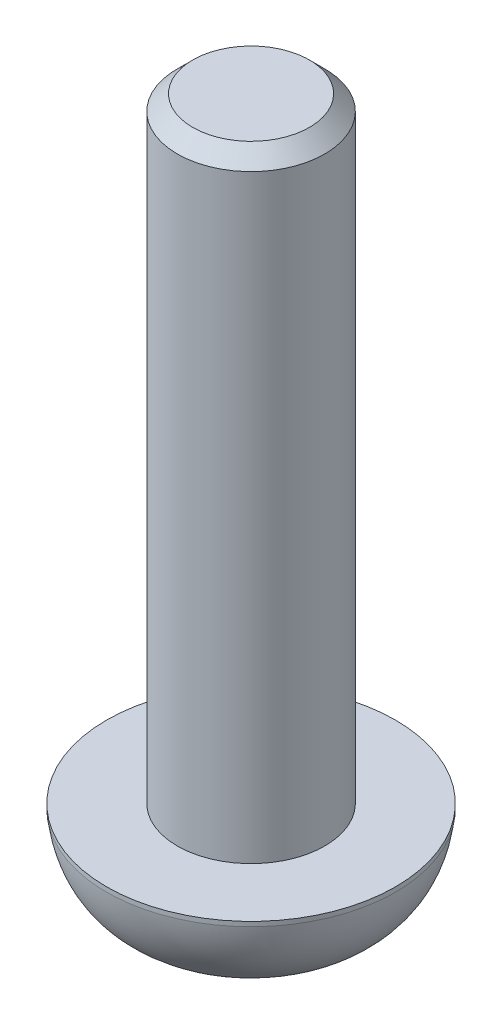
ISO-10303-21;
HEADER;
FILE_DESCRIPTION(('STEP AP214'),'2;1');
FILE_NAME('part.step','',(''),(''),'','','');
FILE_SCHEMA(('AUTOMOTIVE_DESIGN { 1 0 10303 214 1 1 1 1 }'));
ENDSEC;
DATA;
#1=APPLICATION_CONTEXT('core data for automotive mechanical design processes');
#2=APPLICATION_PROTOCOL_DEFINITION('international standard','automotive_design',2000,#1);
#3=PRODUCT_CONTEXT('',#1,'mechanical');
#4=PRODUCT('Part','Part','',(#3));
#5=PRODUCT_RELATED_PRODUCT_CATEGORY('part','',(#4));
#6=PRODUCT_DEFINITION_FORMATION('','',#4);
#7=PRODUCT_DEFINITION_CONTEXT('part definition',#1,'design');
#8=PRODUCT_DEFINITION('design','',#6,#7);
#9=PRODUCT_DEFINITION_SHAPE('','',#8);
#10=(LENGTH_UNIT() NAMED_UNIT(*) SI_UNIT(.MILLI.,.METRE.));
#11=(NAMED_UNIT(*) PLANE_ANGLE_UNIT() SI_UNIT($,.RADIAN.));
#12=(NAMED_UNIT(*) SI_UNIT($,.STERADIAN.) SOLID_ANGLE_UNIT());
#13=UNCERTAINTY_MEASURE_WITH_UNIT(LENGTH_MEASURE(1.E-05),#10,'distance_accuracy_value','');
#14=(GEOMETRIC_REPRESENTATION_CONTEXT(3) GLOBAL_UNCERTAINTY_ASSIGNED_CONTEXT((#13)) GLOBAL_UNIT_ASSIGNED_CONTEXT((#10,
#11,#12)) REPRESENTATION_CONTEXT('',''));
#15=CARTESIAN_POINT('',(0.,0.,0.));
#16=DIRECTION('',(0.,0.,1.));
#17=DIRECTION('',(1.,0.,0.));
#18=AXIS2_PLACEMENT_3D('',#15,#16,#17);
#19=CARTESIAN_POINT('',(0.,3.,0.));
#20=DIRECTION('',(0.,-1.,0.));
#21=DIRECTION('',(0.,0.,-1.));
#22=AXIS2_PLACEMENT_3D('',#19,#20,#21);
#23=CYLINDRICAL_SURFACE('',#22,4.7);
#24=CARTESIAN_POINT('',(0.,2.85,0.));
#25=DIRECTION('',(0.,-1.,0.));
#26=DIRECTION('',(0.,0.,-1.));
#27=AXIS2_PLACEMENT_3D('',#24,#25,#26);
#28=CIRCLE('',#27,4.7);
#29=CARTESIAN_POINT('',(0.,2.85,-4.7));
#30=VERTEX_POINT('',#29);
#31=EDGE_CURVE('E198',#30,#30,#28,.T.);
#32=ORIENTED_EDGE('',*,*,#31,.F.);
#33=EDGE_LOOP('',(#32));
#34=FACE_BOUND('',#33,.T.);
#35=CARTESIAN_POINT('',(0.,3.,0.));
#36=DIRECTION('',(0.,1.,0.));
#37=DIRECTION('',(0.,0.,1.));
#38=AXIS2_PLACEMENT_3D('',#35,#36,#37);
#39=CIRCLE('',#38,4.7);
#40=CARTESIAN_POINT('',(0.,3.,4.7));
#41=VERTEX_POINT('',#40);
#42=EDGE_CURVE('E201',#41,#41,#39,.T.);
#43=ORIENTED_EDGE('',*,*,#42,.F.);
#44=EDGE_LOOP('',(#43));
#45=FACE_BOUND('',#44,.T.);
#46=ADVANCED_FACE('F40',(#34,#45),#23,.T.);
#47=CARTESIAN_POINT('',(0.,3.,0.));
#48=DIRECTION('',(0.,1.,0.));
#49=DIRECTION('',(0.,0.,1.));
#50=AXIS2_PLACEMENT_3D('',#47,#48,#49);
#51=PLANE('',#50);
#52=CARTESIAN_POINT('',(0.,3.,0.));
#53=DIRECTION('',(0.,1.,0.));
#54=DIRECTION('',(0.,0.,1.));
#55=AXIS2_PLACEMENT_3D('',#52,#53,#54);
#56=CIRCLE('',#55,2.4);
#57=CARTESIAN_POINT('',(0.,3.,2.4));
#58=VERTEX_POINT('',#57);
#59=EDGE_CURVE('E204',#58,#58,#56,.T.);
#60=ORIENTED_EDGE('',*,*,#59,.F.);
#61=EDGE_LOOP('',(#60));
#62=FACE_BOUND('',#61,.T.);
#63=ORIENTED_EDGE('',*,*,#42,.T.);
#64=EDGE_LOOP('',(#63));
#65=FACE_BOUND('',#64,.T.);
#66=ADVANCED_FACE('F184',(#62,#65),#51,.T.);
#67=CARTESIAN_POINT('',(0.,23.,0.));
#68=DIRECTION('',(0.,-1.,0.));
#69=DIRECTION('',(0.,0.,-1.));
#70=AXIS2_PLACEMENT_3D('',#67,#68,#69);
#71=CYLINDRICAL_SURFACE('',#70,2.4);
#72=CARTESIAN_POINT('',(0.,22.5,0.));
#73=DIRECTION('',(0.,1.,0.));
#74=DIRECTION('',(0.,0.,1.));
#75=AXIS2_PLACEMENT_3D('',#72,#73,#74);
#76=CIRCLE('',#75,2.4);
#77=CARTESIAN_POINT('',(0.,22.5,2.4));
#78=VERTEX_POINT('',#77);
#79=EDGE_CURVE('E11',#78,#78,#76,.F.);
#80=ORIENTED_EDGE('',*,*,#79,.T.);
#81=EDGE_LOOP('',(#80));
#82=FACE_BOUND('',#81,.T.);
#83=ORIENTED_EDGE('',*,*,#59,.T.);
#84=EDGE_LOOP('',(#83));
#85=FACE_BOUND('',#84,.T.);
#86=ADVANCED_FACE('F180',(#82,#85),#71,.T.);
#87=CARTESIAN_POINT('',(0.,23.,0.));
#88=DIRECTION('',(0.,1.,0.));
#89=DIRECTION('',(0.,0.,1.));
#90=AXIS2_PLACEMENT_3D('',#87,#88,#89);
#91=PLANE('',#90);
#92=CARTESIAN_POINT('',(0.,23.,0.));
#93=DIRECTION('',(0.,1.,0.));
#94=DIRECTION('',(0.,0.,1.));
#95=AXIS2_PLACEMENT_3D('',#92,#93,#94);
#96=CIRCLE('',#95,1.9);
#97=CARTESIAN_POINT('',(0.,23.,1.9));
#98=VERTEX_POINT('',#97);
#99=EDGE_CURVE('E50',#98,#98,#96,.T.);
#100=ORIENTED_EDGE('',*,*,#99,.T.);
#101=EDGE_LOOP('',(#100));
#102=FACE_BOUND('',#101,.T.);
#103=ADVANCED_FACE('F174',(#102),#91,.T.);
#104=CARTESIAN_POINT('',(4.7,2.85,0.));
#105=CARTESIAN_POINT('',(4.43246222771423,0.599611143243104,0.));
#106=CARTESIAN_POINT('',(2.35,0.,0.));
#107=B_SPLINE_CURVE_WITH_KNOTS('',2,(#104,#105,#106),.UNSPECIFIED.,.F.,.F.,(3,3),(0.,1.),.UNSPECIFIED.);
#108=CARTESIAN_POINT('',(0.,0.,0.));
#109=DIRECTION('',(0.,-1.,0.));
#110=AXIS1_PLACEMENT('',#108,#109);
#111=SURFACE_OF_REVOLUTION('',#107,#110);
#112=CARTESIAN_POINT('',(0.,0.,0.));
#113=DIRECTION('',(0.,-1.,0.));
#114=DIRECTION('',(0.,0.,-1.));
#115=AXIS2_PLACEMENT_3D('',#112,#113,#114);
#116=CIRCLE('',#115,2.35);
#117=CARTESIAN_POINT('',(0.,0.,-2.35));
#118=VERTEX_POINT('',#117);
#119=EDGE_CURVE('E153',#118,#118,#116,.T.);
#120=ORIENTED_EDGE('',*,*,#119,.F.);
#121=EDGE_LOOP('',(#120));
#122=FACE_BOUND('',#121,.T.);
#123=ORIENTED_EDGE('',*,*,#31,.T.);
#124=EDGE_LOOP('',(#123));
#125=FACE_BOUND('',#124,.T.);
#126=ADVANCED_FACE('F169',(#122,#125),#111,.T.);
#127=CARTESIAN_POINT('',(0.,0.,0.));
#128=DIRECTION('',(0.,1.,0.));
#129=DIRECTION('',(0.,0.,1.));
#130=AXIS2_PLACEMENT_3D('',#127,#128,#129);
#131=PLANE('',#130);
#132=DIRECTION('',(-0.866025403784439,0.,-0.5));
#133=VECTOR('',#132,1.);
#134=CARTESIAN_POINT('',(0.,0.,1.73205080756888));
#135=LINE('',#134,#133);
#136=CARTESIAN_POINT('',(0.,0.,1.73205080756888));
#137=VERTEX_POINT('',#136);
#138=CARTESIAN_POINT('',(-1.5,0.,0.866025403784439));
#139=VERTEX_POINT('',#138);
#140=EDGE_CURVE('E137',#137,#139,#135,.T.);
#141=ORIENTED_EDGE('',*,*,#140,.F.);
#142=DIRECTION('',(-0.866025403784439,0.,0.5));
#143=VECTOR('',#142,1.);
#144=CARTESIAN_POINT('',(1.5,0.,0.86602540378444));
#145=LINE('',#144,#143);
#146=CARTESIAN_POINT('',(1.5,0.,0.86602540378444));
#147=VERTEX_POINT('',#146);
#148=EDGE_CURVE('E57',#147,#137,#145,.T.);
#149=ORIENTED_EDGE('',*,*,#148,.F.);
#150=DIRECTION('',(0.,0.,1.));
#151=VECTOR('',#150,1.);
#152=CARTESIAN_POINT('',(1.5,0.,-0.866025403784439));
#153=LINE('',#152,#151);
#154=CARTESIAN_POINT('',(1.5,0.,-0.866025403784439));
#155=VERTEX_POINT('',#154);
#156=EDGE_CURVE('E149',#155,#147,#153,.T.);
#157=ORIENTED_EDGE('',*,*,#156,.F.);
#158=DIRECTION('',(0.866025403784439,0.,0.5));
#159=VECTOR('',#158,1.);
#160=CARTESIAN_POINT('',(0.,0.,-1.73205080756888));
#161=LINE('',#160,#159);
#162=CARTESIAN_POINT('',(0.,0.,-1.73205080756888));
#163=VERTEX_POINT('',#162);
#164=EDGE_CURVE('E147',#163,#155,#161,.T.);
#165=ORIENTED_EDGE('',*,*,#164,.F.);
#166=DIRECTION('',(0.866025403784438,0.,-0.5));
#167=VECTOR('',#166,1.);
#168=CARTESIAN_POINT('',(-1.5,0.,-0.866025403784438));
#169=LINE('',#168,#167);
#170=CARTESIAN_POINT('',(-1.5,0.,-0.866025403784438));
#171=VERTEX_POINT('',#170);
#172=EDGE_CURVE('E105',#171,#163,#169,.T.);
#173=ORIENTED_EDGE('',*,*,#172,.F.);
#174=DIRECTION('',(0.,0.,-1.));
#175=VECTOR('',#174,1.);
#176=CARTESIAN_POINT('',(-1.5,0.,0.866025403784439));
#177=LINE('',#176,#175);
#178=EDGE_CURVE('E141',#139,#171,#177,.T.);
#179=ORIENTED_EDGE('',*,*,#178,.F.);
#180=EDGE_LOOP('',(#141,#149,#157,#165,#173,#179));
#181=FACE_BOUND('',#180,.T.);
#182=ORIENTED_EDGE('',*,*,#119,.T.);
#183=EDGE_LOOP('',(#182));
#184=FACE_BOUND('',#183,.T.);
#185=ADVANCED_FACE('F173',(#181,#184),#131,.F.);
#186=CARTESIAN_POINT('',(1.5,1.5,0.86602540378444));
#187=DIRECTION('',(0.5,0.,0.866025403784439));
#188=DIRECTION('',(0.866025403784439,0.,-0.5));
#189=AXIS2_PLACEMENT_3D('',#186,#187,#188);
#190=PLANE('',#189);
#191=ORIENTED_EDGE('',*,*,#148,.T.);
#192=DIRECTION('',(0.,-1.,0.));
#193=VECTOR('',#192,1.);
#194=CARTESIAN_POINT('',(0.,1.5,1.73205080756888));
#195=LINE('',#194,#193);
#196=CARTESIAN_POINT('',(0.,1.5,1.73205080756888));
#197=VERTEX_POINT('',#196);
#198=EDGE_CURVE('E87',#197,#137,#195,.T.);
#199=ORIENTED_EDGE('',*,*,#198,.F.);
#200=DIRECTION('',(-0.866025403784439,0.,0.5));
#201=VECTOR('',#200,1.);
#202=CARTESIAN_POINT('',(1.5,1.5,0.86602540378444));
#203=LINE('',#202,#201);
#204=CARTESIAN_POINT('',(1.5,1.5,0.86602540378444));
#205=VERTEX_POINT('',#204);
#206=EDGE_CURVE('E151',#205,#197,#203,.T.);
#207=ORIENTED_EDGE('',*,*,#206,.F.);
#208=DIRECTION('',(0.,-1.,0.));
#209=VECTOR('',#208,1.);
#210=CARTESIAN_POINT('',(1.5,1.5,0.86602540378444));
#211=LINE('',#210,#209);
#212=EDGE_CURVE('E65',#205,#147,#211,.T.);
#213=ORIENTED_EDGE('',*,*,#212,.T.);
#214=EDGE_LOOP('',(#191,#199,#207,#213));
#215=FACE_BOUND('',#214,.T.);
#216=ADVANCED_FACE('F176',(#215),#190,.F.);
#217=CARTESIAN_POINT('',(1.5,1.5,-0.866025403784439));
#218=DIRECTION('',(1.,0.,0.));
#219=DIRECTION('',(0.,0.,-1.));
#220=AXIS2_PLACEMENT_3D('',#217,#218,#219);
#221=PLANE('',#220);
#222=ORIENTED_EDGE('',*,*,#156,.T.);
#223=ORIENTED_EDGE('',*,*,#212,.F.);
#224=DIRECTION('',(0.,0.,1.));
#225=VECTOR('',#224,1.);
#226=CARTESIAN_POINT('',(1.5,1.5,-0.866025403784439));
#227=LINE('',#226,#225);
#228=CARTESIAN_POINT('',(1.5,1.5,-0.866025403784439));
#229=VERTEX_POINT('',#228);
#230=EDGE_CURVE('E117',#229,#205,#227,.T.);
#231=ORIENTED_EDGE('',*,*,#230,.F.);
#232=DIRECTION('',(0.,-1.,0.));
#233=VECTOR('',#232,1.);
#234=CARTESIAN_POINT('',(1.5,1.5,-0.866025403784439));
#235=LINE('',#234,#233);
#236=EDGE_CURVE('E109',#229,#155,#235,.T.);
#237=ORIENTED_EDGE('',*,*,#236,.T.);
#238=EDGE_LOOP('',(#222,#223,#231,#237));
#239=FACE_BOUND('',#238,.T.);
#240=ADVANCED_FACE('F232',(#239),#221,.F.);
#241=CARTESIAN_POINT('',(0.,1.5,-1.73205080756888));
#242=DIRECTION('',(0.5,0.,-0.866025403784439));
#243=DIRECTION('',(-0.866025403784439,0.,-0.5));
#244=AXIS2_PLACEMENT_3D('',#241,#242,#243);
#245=PLANE('',#244);
#246=ORIENTED_EDGE('',*,*,#164,.T.);
#247=ORIENTED_EDGE('',*,*,#236,.F.);
#248=DIRECTION('',(0.866025403784439,0.,0.5));
#249=VECTOR('',#248,1.);
#250=CARTESIAN_POINT('',(0.,1.5,-1.73205080756888));
#251=LINE('',#250,#249);
#252=CARTESIAN_POINT('',(0.,1.5,-1.73205080756888));
#253=VERTEX_POINT('',#252);
#254=EDGE_CURVE('E113',#253,#229,#251,.T.);
#255=ORIENTED_EDGE('',*,*,#254,.F.);
#256=DIRECTION('',(0.,-1.,0.));
#257=VECTOR('',#256,1.);
#258=CARTESIAN_POINT('',(0.,1.5,-1.73205080756888));
#259=LINE('',#258,#257);
#260=EDGE_CURVE('E98',#253,#163,#259,.T.);
#261=ORIENTED_EDGE('',*,*,#260,.T.);
#262=EDGE_LOOP('',(#246,#247,#255,#261));
#263=FACE_BOUND('',#262,.T.);
#264=ADVANCED_FACE('F114',(#263),#245,.F.);
#265=CARTESIAN_POINT('',(-1.5,1.5,-0.866025403784438));
#266=DIRECTION('',(-0.5,0.,-0.866025403784439));
#267=DIRECTION('',(-0.866025403784439,0.,0.5));
#268=AXIS2_PLACEMENT_3D('',#265,#266,#267);
#269=PLANE('',#268);
#270=ORIENTED_EDGE('',*,*,#172,.T.);
#271=ORIENTED_EDGE('',*,*,#260,.F.);
#272=DIRECTION('',(0.866025403784438,0.,-0.5));
#273=VECTOR('',#272,1.);
#274=CARTESIAN_POINT('',(-1.5,1.5,-0.866025403784438));
#275=LINE('',#274,#273);
#276=CARTESIAN_POINT('',(-1.5,1.5,-0.866025403784438));
#277=VERTEX_POINT('',#276);
#278=EDGE_CURVE('E102',#277,#253,#275,.T.);
#279=ORIENTED_EDGE('',*,*,#278,.F.);
#280=DIRECTION('',(0.,-1.,0.));
#281=VECTOR('',#280,1.);
#282=CARTESIAN_POINT('',(-1.5,1.5,-0.866025403784438));
#283=LINE('',#282,#281);
#284=EDGE_CURVE('E110',#277,#171,#283,.T.);
#285=ORIENTED_EDGE('',*,*,#284,.T.);
#286=EDGE_LOOP('',(#270,#271,#279,#285));
#287=FACE_BOUND('',#286,.T.);
#288=ADVANCED_FACE('F100',(#287),#269,.F.);
#289=CARTESIAN_POINT('',(-1.5,1.5,0.866025403784439));
#290=DIRECTION('',(-1.,0.,0.));
#291=DIRECTION('',(0.,0.,1.));
#292=AXIS2_PLACEMENT_3D('',#289,#290,#291);
#293=PLANE('',#292);
#294=ORIENTED_EDGE('',*,*,#178,.T.);
#295=ORIENTED_EDGE('',*,*,#284,.F.);
#296=DIRECTION('',(0.,0.,-1.));
#297=VECTOR('',#296,1.);
#298=CARTESIAN_POINT('',(-1.5,1.5,0.866025403784439));
#299=LINE('',#298,#297);
#300=CARTESIAN_POINT('',(-1.5,1.5,0.866025403784439));
#301=VERTEX_POINT('',#300);
#302=EDGE_CURVE('E123',#301,#277,#299,.T.);
#303=ORIENTED_EDGE('',*,*,#302,.F.);
#304=DIRECTION('',(0.,-1.,0.));
#305=VECTOR('',#304,1.);
#306=CARTESIAN_POINT('',(-1.5,1.5,0.866025403784439));
#307=LINE('',#306,#305);
#308=EDGE_CURVE('E156',#301,#139,#307,.T.);
#309=ORIENTED_EDGE('',*,*,#308,.T.);
#310=EDGE_LOOP('',(#294,#295,#303,#309));
#311=FACE_BOUND('',#310,.T.);
#312=ADVANCED_FACE('F229',(#311),#293,.F.);
#313=CARTESIAN_POINT('',(0.,1.5,1.73205080756888));
#314=DIRECTION('',(-0.5,0.,0.866025403784439));
#315=DIRECTION('',(0.866025403784439,0.,0.5));
#316=AXIS2_PLACEMENT_3D('',#313,#314,#315);
#317=PLANE('',#316);
#318=ORIENTED_EDGE('',*,*,#140,.T.);
#319=ORIENTED_EDGE('',*,*,#308,.F.);
#320=DIRECTION('',(-0.866025403784439,0.,-0.5));
#321=VECTOR('',#320,1.);
#322=CARTESIAN_POINT('',(0.,1.5,1.73205080756888));
#323=LINE('',#322,#321);
#324=EDGE_CURVE('E129',#197,#301,#323,.T.);
#325=ORIENTED_EDGE('',*,*,#324,.F.);
#326=ORIENTED_EDGE('',*,*,#198,.T.);
#327=EDGE_LOOP('',(#318,#319,#325,#326));
#328=FACE_BOUND('',#327,.T.);
#329=ADVANCED_FACE('F221',(#328),#317,.F.);
#330=CARTESIAN_POINT('',(0.,1.5,0.));
#331=DIRECTION('',(0.,-1.,0.));
#332=DIRECTION('',(0.,0.,-1.));
#333=AXIS2_PLACEMENT_3D('',#330,#331,#332);
#334=PLANE('',#333);
#335=ORIENTED_EDGE('',*,*,#206,.T.);
#336=ORIENTED_EDGE('',*,*,#324,.T.);
#337=ORIENTED_EDGE('',*,*,#302,.T.);
#338=ORIENTED_EDGE('',*,*,#278,.T.);
#339=ORIENTED_EDGE('',*,*,#254,.T.);
#340=ORIENTED_EDGE('',*,*,#230,.T.);
#341=EDGE_LOOP('',(#335,#336,#337,#338,#339,#340));
#342=FACE_BOUND('',#341,.T.);
#343=ADVANCED_FACE('F120',(#342),#334,.T.);
#344=CARTESIAN_POINT('',(0.,23.,0.));
#345=DIRECTION('',(0.,-1.,0.));
#346=DIRECTION('',(0.,0.,-1.));
#347=AXIS2_PLACEMENT_3D('',#344,#345,#346);
#348=CONICAL_SURFACE('',#347,1.9,0.785398163397449);
#349=ORIENTED_EDGE('',*,*,#79,.F.);
#350=EDGE_LOOP('',(#349));
#351=FACE_BOUND('',#350,.T.);
#352=ORIENTED_EDGE('',*,*,#99,.F.);
#353=EDGE_LOOP('',(#352));
#354=FACE_BOUND('',#353,.T.);
#355=ADVANCED_FACE('F43',(#351,#354),#348,.T.);
#356=CLOSED_SHELL('',(#46,#66,#86,#103,#126,#185,#216,#240,#264,#288,#312,#329,#343,#355));
#357=MANIFOLD_SOLID_BREP('B2',#356);
#358=ADVANCED_BREP_SHAPE_REPRESENTATION('',(#18,#357),#14);
#359=SHAPE_DEFINITION_REPRESENTATION(#9,#358);
ENDSEC;
END-ISO-10303-21;
